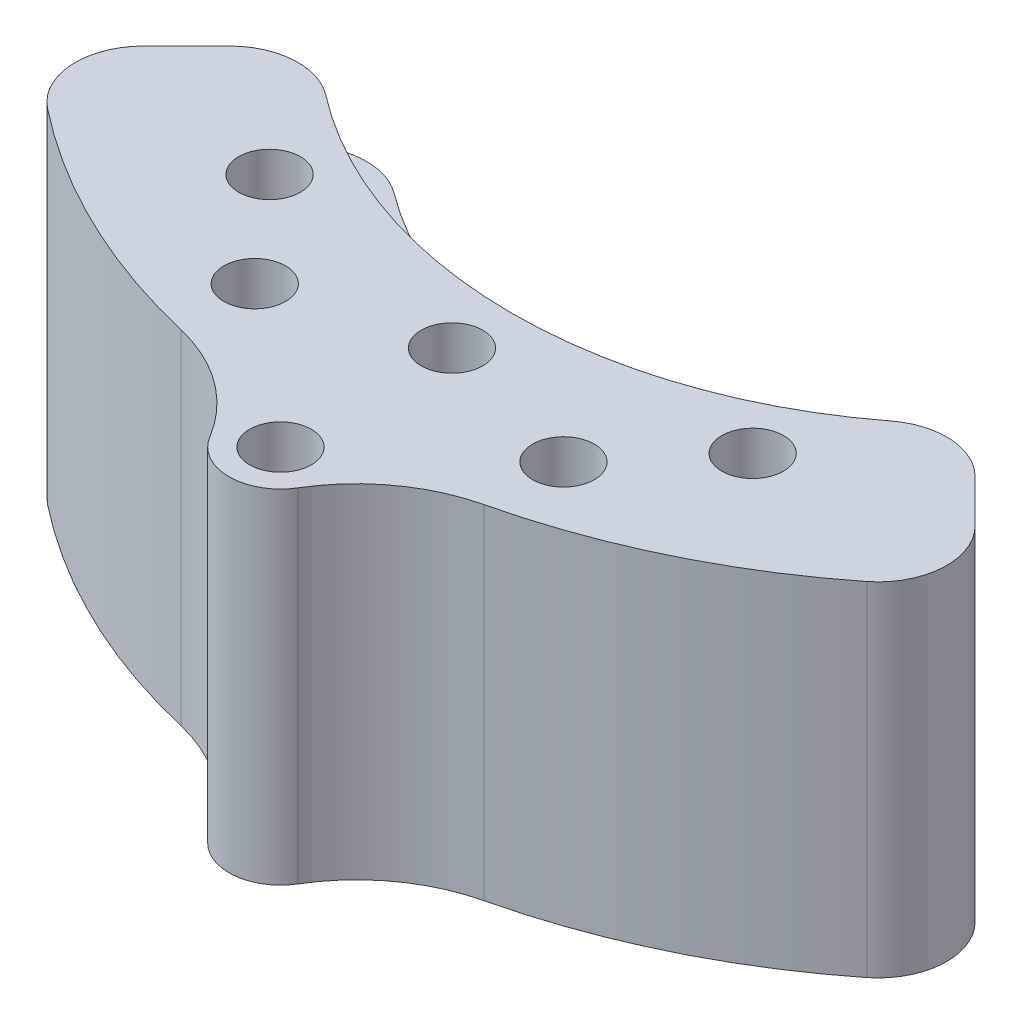
ISO-10303-21;
HEADER;
FILE_DESCRIPTION(('STEP AP214'),'2;1');
FILE_NAME('part.step','',(''),(''),'','','');
FILE_SCHEMA(('AUTOMOTIVE_DESIGN { 1 0 10303 214 1 1 1 1 }'));
ENDSEC;
DATA;
#1=APPLICATION_CONTEXT('core data for automotive mechanical design processes');
#2=APPLICATION_PROTOCOL_DEFINITION('international standard','automotive_design',2000,#1);
#3=PRODUCT_CONTEXT('',#1,'mechanical');
#4=PRODUCT('Part','Part','',(#3));
#5=PRODUCT_RELATED_PRODUCT_CATEGORY('part','',(#4));
#6=PRODUCT_DEFINITION_FORMATION('','',#4);
#7=PRODUCT_DEFINITION_CONTEXT('part definition',#1,'design');
#8=PRODUCT_DEFINITION('design','',#6,#7);
#9=PRODUCT_DEFINITION_SHAPE('','',#8);
#10=(LENGTH_UNIT() NAMED_UNIT(*) SI_UNIT(.MILLI.,.METRE.));
#11=(NAMED_UNIT(*) PLANE_ANGLE_UNIT() SI_UNIT($,.RADIAN.));
#12=(NAMED_UNIT(*) SI_UNIT($,.STERADIAN.) SOLID_ANGLE_UNIT());
#13=UNCERTAINTY_MEASURE_WITH_UNIT(LENGTH_MEASURE(1.E-05),#10,'distance_accuracy_value','');
#14=(GEOMETRIC_REPRESENTATION_CONTEXT(3) GLOBAL_UNCERTAINTY_ASSIGNED_CONTEXT((#13)) GLOBAL_UNIT_ASSIGNED_CONTEXT((#10,
#11,#12)) REPRESENTATION_CONTEXT('',''));
#15=CARTESIAN_POINT('',(0.,0.,0.));
#16=DIRECTION('',(0.,0.,1.));
#17=DIRECTION('',(1.,0.,0.));
#18=AXIS2_PLACEMENT_3D('',#15,#16,#17);
#19=CARTESIAN_POINT('',(0.,25.4,0.));
#20=DIRECTION('',(0.,-1.,0.));
#21=DIRECTION('',(0.,0.,-1.));
#22=AXIS2_PLACEMENT_3D('',#19,#20,#21);
#23=CYLINDRICAL_SURFACE('',#22,48.895);
#24=CARTESIAN_POINT('',(0.,0.,0.));
#25=DIRECTION('',(0.,1.,0.));
#26=DIRECTION('',(0.,0.,1.));
#27=AXIS2_PLACEMENT_3D('',#24,#25,#26);
#28=CIRCLE('',#27,48.895);
#29=CARTESIAN_POINT('',(-30.3322403894984,0.,38.3493965787427));
#30=VERTEX_POINT('',#29);
#31=CARTESIAN_POINT('',(-11.2289519784086,0.,47.5881462390225));
#32=VERTEX_POINT('',#31);
#33=EDGE_CURVE('E488',#30,#32,#28,.T.);
#34=ORIENTED_EDGE('',*,*,#33,.T.);
#35=DIRECTION('',(0.,-1.,0.));
#36=VECTOR('',#35,1.);
#37=CARTESIAN_POINT('',(-11.2289519784086,25.4,47.5881462390225));
#38=LINE('',#37,#36);
#39=CARTESIAN_POINT('',(-11.2289519784086,25.4,47.5881462390225));
#40=VERTEX_POINT('',#39);
#41=EDGE_CURVE('E384',#32,#40,#38,.F.);
#42=ORIENTED_EDGE('',*,*,#41,.T.);
#43=CARTESIAN_POINT('',(0.,25.4,0.));
#44=DIRECTION('',(0.,1.,0.));
#45=DIRECTION('',(0.,0.,1.));
#46=AXIS2_PLACEMENT_3D('',#43,#44,#45);
#47=CIRCLE('',#46,48.895);
#48=CARTESIAN_POINT('',(-30.3322403894984,25.4,38.3493965787427));
#49=VERTEX_POINT('',#48);
#50=EDGE_CURVE('E197',#49,#40,#47,.T.);
#51=ORIENTED_EDGE('',*,*,#50,.F.);
#52=DIRECTION('',(0.,-1.,0.));
#53=VECTOR('',#52,1.);
#54=CARTESIAN_POINT('',(-30.3322403894984,25.4,38.3493965787427));
#55=LINE('',#54,#53);
#56=EDGE_CURVE('E219',#49,#30,#55,.T.);
#57=ORIENTED_EDGE('',*,*,#56,.T.);
#58=EDGE_LOOP('',(#34,#42,#51,#57));
#59=FACE_BOUND('',#58,.T.);
#60=ADVANCED_FACE('F44',(#59),#23,.T.);
#61=CARTESIAN_POINT('',(0.,25.4,0.));
#62=DIRECTION('',(0.,-1.,0.));
#63=DIRECTION('',(0.,0.,-1.));
#64=AXIS2_PLACEMENT_3D('',#61,#62,#63);
#65=CYLINDRICAL_SURFACE('',#64,30.734);
#66=CARTESIAN_POINT('',(0.,19.05,0.));
#67=DIRECTION('',(0.,1.,0.));
#68=DIRECTION('',(0.,0.,1.));
#69=AXIS2_PLACEMENT_3D('',#66,#67,#68);
#70=CIRCLE('',#69,30.734);
#71=CARTESIAN_POINT('',(18.429901575853,19.05,24.5950703171259));
#72=VERTEX_POINT('',#71);
#73=CARTESIAN_POINT('',(-18.429901575853,19.05,24.595070317126));
#74=VERTEX_POINT('',#73);
#75=EDGE_CURVE('E447',#72,#74,#70,.F.);
#76=ORIENTED_EDGE('',*,*,#75,.F.);
#77=DIRECTION('',(0.,-1.,0.));
#78=VECTOR('',#77,1.);
#79=CARTESIAN_POINT('',(18.429901575853,25.4,24.595070317126));
#80=LINE('',#79,#78);
#81=CARTESIAN_POINT('',(18.429901575853,0.,24.5950703171259));
#82=VERTEX_POINT('',#81);
#83=EDGE_CURVE('E230',#72,#82,#80,.T.);
#84=ORIENTED_EDGE('',*,*,#83,.T.);
#85=CARTESIAN_POINT('',(0.,0.,0.));
#86=DIRECTION('',(0.,-1.,0.));
#87=DIRECTION('',(0.,0.,1.));
#88=AXIS2_PLACEMENT_3D('',#85,#86,#87);
#89=CIRCLE('',#88,30.734);
#90=CARTESIAN_POINT('',(-18.429901575853,0.,24.595070317126));
#91=VERTEX_POINT('',#90);
#92=EDGE_CURVE('E472',#82,#91,#89,.T.);
#93=ORIENTED_EDGE('',*,*,#92,.T.);
#94=DIRECTION('',(0.,-1.,0.));
#95=VECTOR('',#94,1.);
#96=CARTESIAN_POINT('',(-18.429901575853,25.4,24.595070317126));
#97=LINE('',#96,#95);
#98=EDGE_CURVE('E184',#91,#74,#97,.F.);
#99=ORIENTED_EDGE('',*,*,#98,.T.);
#100=EDGE_LOOP('',(#76,#84,#93,#99));
#101=FACE_BOUND('',#100,.T.);
#102=ADVANCED_FACE('F316',(#101),#65,.F.);
#103=CARTESIAN_POINT('',(0.,25.4,0.));
#104=DIRECTION('',(0.,1.,0.));
#105=DIRECTION('',(0.,0.,1.));
#106=AXIS2_PLACEMENT_3D('',#103,#104,#105);
#107=PLANE('',#106);
#108=CARTESIAN_POINT('',(11.43,25.4,41.91));
#109=DIRECTION('',(0.,1.,0.));
#110=DIRECTION('',(0.,0.,1.));
#111=AXIS2_PLACEMENT_3D('',#108,#109,#110);
#112=CIRCLE('',#111,2.286);
#113=CARTESIAN_POINT('',(11.43,25.4,44.196));
#114=VERTEX_POINT('',#113);
#115=EDGE_CURVE('E426',#114,#114,#112,.T.);
#116=ORIENTED_EDGE('',*,*,#115,.F.);
#117=EDGE_LOOP('',(#116));
#118=FACE_BOUND('',#117,.T.);
#119=CARTESIAN_POINT('',(-11.43,25.4,41.91));
#120=DIRECTION('',(0.,1.,0.));
#121=DIRECTION('',(0.,0.,-1.));
#122=AXIS2_PLACEMENT_3D('',#119,#120,#121);
#123=CIRCLE('',#122,2.286);
#124=CARTESIAN_POINT('',(-11.43,25.4,39.624));
#125=VERTEX_POINT('',#124);
#126=EDGE_CURVE('E432',#125,#125,#123,.T.);
#127=ORIENTED_EDGE('',*,*,#126,.F.);
#128=EDGE_LOOP('',(#127));
#129=FACE_BOUND('',#128,.T.);
#130=CARTESIAN_POINT('',(0.,25.4,0.));
#131=DIRECTION('',(0.,1.,0.));
#132=DIRECTION('',(0.,0.,1.));
#133=AXIS2_PLACEMENT_3D('',#130,#131,#132);
#134=CIRCLE('',#133,34.29);
#135=CARTESIAN_POINT('',(-20.9153934462159,25.4,27.1726041628326));
#136=VERTEX_POINT('',#135);
#137=CARTESIAN_POINT('',(20.9153934462164,25.4,27.1726041628322));
#138=VERTEX_POINT('',#137);
#139=EDGE_CURVE('E415',#136,#138,#134,.T.);
#140=ORIENTED_EDGE('',*,*,#139,.F.);
#141=CARTESIAN_POINT('',(-24.0139702530633,25.4,31.1981751499185));
#142=DIRECTION('',(0.,1.,0.));
#143=DIRECTION('',(0.,0.,1.));
#144=AXIS2_PLACEMENT_3D('',#141,#142,#143);
#145=CIRCLE('',#144,5.08);
#146=CARTESIAN_POINT('',(-27.6060727014909,25.4,27.6060727014908));
#147=VERTEX_POINT('',#146);
#148=EDGE_CURVE('E258',#136,#147,#145,.T.);
#149=ORIENTED_EDGE('',*,*,#148,.T.);
#150=DIRECTION('',(-0.707106781186549,0.,0.707106781186547));
#151=VECTOR('',#150,1.);
#152=CARTESIAN_POINT('',(-21.7322198129874,25.4,21.7322198129873));
#153=LINE('',#152,#151);
#154=CARTESIAN_POINT('',(-30.7729412390172,25.4,30.7729412390171));
#155=VERTEX_POINT('',#154);
#156=EDGE_CURVE('E377',#147,#155,#153,.T.);
#157=ORIENTED_EDGE('',*,*,#156,.T.);
#158=CARTESIAN_POINT('',(-27.1808387905895,25.4,34.3650436874447));
#159=DIRECTION('',(0.,1.,0.));
#160=DIRECTION('',(0.,0.,1.));
#161=AXIS2_PLACEMENT_3D('',#158,#159,#160);
#162=CIRCLE('',#161,5.08);
#163=EDGE_CURVE('E185',#155,#49,#162,.T.);
#164=ORIENTED_EDGE('',*,*,#163,.T.);
#165=ORIENTED_EDGE('',*,*,#50,.T.);
#166=CARTESIAN_POINT('',(-14.1455628818913,25.4,59.9487037037037));
#167=DIRECTION('',(0.,1.,0.));
#168=DIRECTION('',(0.,0.,1.));
#169=AXIS2_PLACEMENT_3D('',#166,#167,#168);
#170=CIRCLE('',#169,12.7);
#171=CARTESIAN_POINT('',(-3.26436066505185,25.4,53.3997008547009));
#172=VERTEX_POINT('',#171);
#173=EDGE_CURVE('E53',#40,#172,#170,.F.);
#174=ORIENTED_EDGE('',*,*,#173,.T.);
#175=CARTESIAN_POINT('',(0.,25.4,51.435));
#176=DIRECTION('',(0.,1.,0.));
#177=DIRECTION('',(0.,0.,1.));
#178=AXIS2_PLACEMENT_3D('',#175,#176,#177);
#179=CIRCLE('',#178,3.81);
#180=CARTESIAN_POINT('',(3.26436066505185,25.4,53.3997008547009));
#181=VERTEX_POINT('',#180);
#182=EDGE_CURVE('E401',#172,#181,#179,.T.);
#183=ORIENTED_EDGE('',*,*,#182,.T.);
#184=CARTESIAN_POINT('',(14.1455628818913,25.4,59.9487037037037));
#185=DIRECTION('',(0.,1.,0.));
#186=DIRECTION('',(0.,0.,1.));
#187=AXIS2_PLACEMENT_3D('',#184,#185,#186);
#188=CIRCLE('',#187,12.7);
#189=CARTESIAN_POINT('',(11.2289519784086,25.4,47.5881462390225));
#190=VERTEX_POINT('',#189);
#191=EDGE_CURVE('E380',#181,#190,#188,.F.);
#192=ORIENTED_EDGE('',*,*,#191,.T.);
#193=CARTESIAN_POINT('',(30.3322403894984,25.4,38.3493965787426));
#194=VERTEX_POINT('',#193);
#195=EDGE_CURVE('E178',#190,#194,#47,.T.);
#196=ORIENTED_EDGE('',*,*,#195,.T.);
#197=CARTESIAN_POINT('',(27.1808387905895,25.4,34.3650436874447));
#198=DIRECTION('',(0.,1.,0.));
#199=DIRECTION('',(0.,0.,1.));
#200=AXIS2_PLACEMENT_3D('',#197,#198,#199);
#201=CIRCLE('',#200,5.08);
#202=CARTESIAN_POINT('',(30.7729412390172,25.4,30.772941239017));
#203=VERTEX_POINT('',#202);
#204=EDGE_CURVE('E170',#194,#203,#201,.T.);
#205=ORIENTED_EDGE('',*,*,#204,.T.);
#206=DIRECTION('',(-0.707106781186549,0.,-0.707106781186546));
#207=VECTOR('',#206,1.);
#208=CARTESIAN_POINT('',(21.7322198129874,25.4,21.7322198129873));
#209=LINE('',#208,#207);
#210=CARTESIAN_POINT('',(27.6060727014909,25.4,27.6060727014908));
#211=VERTEX_POINT('',#210);
#212=EDGE_CURVE('E175',#203,#211,#209,.T.);
#213=ORIENTED_EDGE('',*,*,#212,.T.);
#214=CARTESIAN_POINT('',(24.0139702530633,25.4,31.1981751499185));
#215=DIRECTION('',(0.,1.,0.));
#216=DIRECTION('',(0.,0.,1.));
#217=AXIS2_PLACEMENT_3D('',#214,#215,#216);
#218=CIRCLE('',#217,5.08);
#219=EDGE_CURVE('E255',#211,#138,#218,.T.);
#220=ORIENTED_EDGE('',*,*,#219,.T.);
#221=EDGE_LOOP('',(#140,#149,#157,#164,#165,#174,#183,#192,#196,#205,#213,#220));
#222=FACE_BOUND('',#221,.T.);
#223=CARTESIAN_POINT('',(17.8858325336585,25.4,34.3583646231584));
#224=DIRECTION('',(0.,1.,0.));
#225=DIRECTION('',(0.,0.,1.));
#226=AXIS2_PLACEMENT_3D('',#223,#224,#225);
#227=CIRCLE('',#226,2.28600000000691);
#228=CARTESIAN_POINT('',(17.8858325336585,25.4,36.6443646231653));
#229=VERTEX_POINT('',#228);
#230=EDGE_CURVE('E460',#229,#229,#227,.T.);
#231=ORIENTED_EDGE('',*,*,#230,.F.);
#232=EDGE_LOOP('',(#231));
#233=FACE_BOUND('',#232,.T.);
#234=CARTESIAN_POINT('',(-5.73089360601551E-13,25.4,38.735));
#235=DIRECTION('',(0.,1.,0.));
#236=DIRECTION('',(0.,0.,1.));
#237=AXIS2_PLACEMENT_3D('',#234,#235,#236);
#238=CIRCLE('',#237,2.28600000000691);
#239=CARTESIAN_POINT('',(-5.73089360601551E-13,25.4,41.0210000000069));
#240=VERTEX_POINT('',#239);
#241=EDGE_CURVE('E468',#240,#240,#238,.T.);
#242=ORIENTED_EDGE('',*,*,#241,.F.);
#243=EDGE_LOOP('',(#242));
#244=FACE_BOUND('',#243,.T.);
#245=CARTESIAN_POINT('',(-17.8858325336597,25.4,34.3583646231584));
#246=DIRECTION('',(0.,1.,0.));
#247=DIRECTION('',(0.,0.,1.));
#248=AXIS2_PLACEMENT_3D('',#245,#246,#247);
#249=CIRCLE('',#248,2.28600000000691);
#250=CARTESIAN_POINT('',(-17.8858325336597,25.4,36.6443646231653));
#251=VERTEX_POINT('',#250);
#252=EDGE_CURVE('E452',#251,#251,#249,.T.);
#253=ORIENTED_EDGE('',*,*,#252,.F.);
#254=EDGE_LOOP('',(#253));
#255=FACE_BOUND('',#254,.T.);
#256=CARTESIAN_POINT('',(0.,25.4,51.435));
#257=DIRECTION('',(0.,1.,0.));
#258=DIRECTION('',(0.,0.,1.));
#259=AXIS2_PLACEMENT_3D('',#256,#257,#258);
#260=CIRCLE('',#259,2.286);
#261=CARTESIAN_POINT('',(0.,25.4,53.721));
#262=VERTEX_POINT('',#261);
#263=EDGE_CURVE('E407',#262,#262,#260,.T.);
#264=ORIENTED_EDGE('',*,*,#263,.F.);
#265=EDGE_LOOP('',(#264));
#266=FACE_BOUND('',#265,.T.);
#267=ADVANCED_FACE('F173',(#118,#129,#222,#233,#244,#255,#266),#107,.T.);
#268=CARTESIAN_POINT('',(0.,0.,0.));
#269=DIRECTION('',(0.,1.,0.));
#270=DIRECTION('',(0.,0.,1.));
#271=AXIS2_PLACEMENT_3D('',#268,#269,#270);
#272=PLANE('',#271);
#273=CARTESIAN_POINT('',(11.43,0.,41.91));
#274=DIRECTION('',(0.,1.,0.));
#275=DIRECTION('',(0.,0.,1.));
#276=AXIS2_PLACEMENT_3D('',#273,#274,#275);
#277=CIRCLE('',#276,2.286);
#278=CARTESIAN_POINT('',(11.43,0.,44.196));
#279=VERTEX_POINT('',#278);
#280=EDGE_CURVE('E418',#279,#279,#277,.T.);
#281=ORIENTED_EDGE('',*,*,#280,.T.);
#282=EDGE_LOOP('',(#281));
#283=FACE_BOUND('',#282,.T.);
#284=CARTESIAN_POINT('',(-11.43,0.,41.91));
#285=DIRECTION('',(0.,1.,0.));
#286=DIRECTION('',(0.,0.,-1.));
#287=AXIS2_PLACEMENT_3D('',#284,#285,#286);
#288=CIRCLE('',#287,2.286);
#289=CARTESIAN_POINT('',(-11.43,0.,39.624));
#290=VERTEX_POINT('',#289);
#291=EDGE_CURVE('E440',#290,#290,#288,.T.);
#292=ORIENTED_EDGE('',*,*,#291,.T.);
#293=EDGE_LOOP('',(#292));
#294=FACE_BOUND('',#293,.T.);
#295=DIRECTION('',(-0.707106781186549,0.,-0.707106781186546));
#296=VECTOR('',#295,1.);
#297=CARTESIAN_POINT('',(21.7322198129874,0.,21.7322198129873));
#298=LINE('',#297,#296);
#299=CARTESIAN_POINT('',(30.7729412390172,0.,30.772941239017));
#300=VERTEX_POINT('',#299);
#301=CARTESIAN_POINT('',(25.0682687475622,0.,25.0682687475621));
#302=VERTEX_POINT('',#301);
#303=EDGE_CURVE('E477',#300,#302,#298,.T.);
#304=ORIENTED_EDGE('',*,*,#303,.F.);
#305=CARTESIAN_POINT('',(27.1808387905895,0.,34.3650436874447));
#306=DIRECTION('',(0.,1.,0.));
#307=DIRECTION('',(0.,0.,1.));
#308=AXIS2_PLACEMENT_3D('',#305,#306,#307);
#309=CIRCLE('',#308,5.08);
#310=CARTESIAN_POINT('',(30.3322403894984,0.,38.3493965787426));
#311=VERTEX_POINT('',#310);
#312=EDGE_CURVE('E201',#300,#311,#309,.F.);
#313=ORIENTED_EDGE('',*,*,#312,.T.);
#314=CARTESIAN_POINT('',(11.2289519784086,0.,47.5881462390225));
#315=VERTEX_POINT('',#314);
#316=EDGE_CURVE('E487',#315,#311,#28,.T.);
#317=ORIENTED_EDGE('',*,*,#316,.F.);
#318=CARTESIAN_POINT('',(14.1455628818913,0.,59.9487037037037));
#319=DIRECTION('',(0.,1.,0.));
#320=DIRECTION('',(0.,0.,1.));
#321=AXIS2_PLACEMENT_3D('',#318,#319,#320);
#322=CIRCLE('',#321,12.7);
#323=CARTESIAN_POINT('',(3.26436066505185,0.,53.3997008547009));
#324=VERTEX_POINT('',#323);
#325=EDGE_CURVE('E382',#315,#324,#322,.T.);
#326=ORIENTED_EDGE('',*,*,#325,.T.);
#327=CARTESIAN_POINT('',(0.,0.,51.435));
#328=DIRECTION('',(0.,1.,0.));
#329=DIRECTION('',(0.,0.,1.));
#330=AXIS2_PLACEMENT_3D('',#327,#328,#329);
#331=CIRCLE('',#330,3.81);
#332=CARTESIAN_POINT('',(-3.26436066505185,0.,53.3997008547009));
#333=VERTEX_POINT('',#332);
#334=EDGE_CURVE('E406',#324,#333,#331,.F.);
#335=ORIENTED_EDGE('',*,*,#334,.T.);
#336=CARTESIAN_POINT('',(-14.1455628818913,0.,59.9487037037037));
#337=DIRECTION('',(0.,1.,0.));
#338=DIRECTION('',(0.,0.,1.));
#339=AXIS2_PLACEMENT_3D('',#336,#337,#338);
#340=CIRCLE('',#339,12.7);
#341=EDGE_CURVE('E11',#333,#32,#340,.T.);
#342=ORIENTED_EDGE('',*,*,#341,.T.);
#343=ORIENTED_EDGE('',*,*,#33,.F.);
#344=CARTESIAN_POINT('',(-27.1808387905895,0.,34.3650436874447));
#345=DIRECTION('',(0.,1.,0.));
#346=DIRECTION('',(0.,0.,1.));
#347=AXIS2_PLACEMENT_3D('',#344,#345,#346);
#348=CIRCLE('',#347,5.08);
#349=CARTESIAN_POINT('',(-30.7729412390172,0.,30.7729412390171));
#350=VERTEX_POINT('',#349);
#351=EDGE_CURVE('E207',#30,#350,#348,.F.);
#352=ORIENTED_EDGE('',*,*,#351,.T.);
#353=DIRECTION('',(-0.707106781186549,0.,0.707106781186547));
#354=VECTOR('',#353,1.);
#355=CARTESIAN_POINT('',(-21.7322198129874,0.,21.7322198129873));
#356=LINE('',#355,#354);
#357=CARTESIAN_POINT('',(-25.0682687475622,0.,25.0682687475621));
#358=VERTEX_POINT('',#357);
#359=EDGE_CURVE('E483',#358,#350,#356,.T.);
#360=ORIENTED_EDGE('',*,*,#359,.F.);
#361=CARTESIAN_POINT('',(-21.4761662991345,0.,28.6603711959898));
#362=DIRECTION('',(0.,1.,0.));
#363=DIRECTION('',(0.,0.,1.));
#364=AXIS2_PLACEMENT_3D('',#361,#362,#363);
#365=CIRCLE('',#364,5.08);
#366=EDGE_CURVE('E203',#358,#91,#365,.F.);
#367=ORIENTED_EDGE('',*,*,#366,.T.);
#368=ORIENTED_EDGE('',*,*,#92,.F.);
#369=CARTESIAN_POINT('',(21.4761662991345,0.,28.6603711959897));
#370=DIRECTION('',(0.,1.,0.));
#371=DIRECTION('',(0.,0.,1.));
#372=AXIS2_PLACEMENT_3D('',#369,#370,#371);
#373=CIRCLE('',#372,5.08);
#374=EDGE_CURVE('E214',#82,#302,#373,.F.);
#375=ORIENTED_EDGE('',*,*,#374,.T.);
#376=EDGE_LOOP('',(#304,#313,#317,#326,#335,#342,#343,#352,#360,#367,#368,#375));
#377=FACE_BOUND('',#376,.T.);
#378=CARTESIAN_POINT('',(-5.73089360601551E-13,0.,38.735));
#379=DIRECTION('',(0.,1.,0.));
#380=DIRECTION('',(0.,0.,1.));
#381=AXIS2_PLACEMENT_3D('',#378,#379,#380);
#382=CIRCLE('',#381,2.28600000000691);
#383=CARTESIAN_POINT('',(-5.73089360601551E-13,0.,41.0210000000069));
#384=VERTEX_POINT('',#383);
#385=EDGE_CURVE('E464',#384,#384,#382,.T.);
#386=ORIENTED_EDGE('',*,*,#385,.T.);
#387=EDGE_LOOP('',(#386));
#388=FACE_BOUND('',#387,.T.);
#389=CARTESIAN_POINT('',(17.8858325336585,0.,34.3583646231584));
#390=DIRECTION('',(0.,1.,0.));
#391=DIRECTION('',(0.,0.,1.));
#392=AXIS2_PLACEMENT_3D('',#389,#390,#391);
#393=CIRCLE('',#392,2.28600000000691);
#394=CARTESIAN_POINT('',(17.8858325336585,0.,36.6443646231653));
#395=VERTEX_POINT('',#394);
#396=EDGE_CURVE('E456',#395,#395,#393,.T.);
#397=ORIENTED_EDGE('',*,*,#396,.T.);
#398=EDGE_LOOP('',(#397));
#399=FACE_BOUND('',#398,.T.);
#400=CARTESIAN_POINT('',(-17.8858325336597,0.,34.3583646231584));
#401=DIRECTION('',(0.,1.,0.));
#402=DIRECTION('',(0.,0.,1.));
#403=AXIS2_PLACEMENT_3D('',#400,#401,#402);
#404=CIRCLE('',#403,2.28600000000691);
#405=CARTESIAN_POINT('',(-17.8858325336597,0.,36.6443646231653));
#406=VERTEX_POINT('',#405);
#407=EDGE_CURVE('E451',#406,#406,#404,.T.);
#408=ORIENTED_EDGE('',*,*,#407,.T.);
#409=EDGE_LOOP('',(#408));
#410=FACE_BOUND('',#409,.T.);
#411=CARTESIAN_POINT('',(0.,0.,51.435));
#412=DIRECTION('',(0.,1.,0.));
#413=DIRECTION('',(0.,0.,1.));
#414=AXIS2_PLACEMENT_3D('',#411,#412,#413);
#415=CIRCLE('',#414,2.286);
#416=CARTESIAN_POINT('',(0.,0.,53.721));
#417=VERTEX_POINT('',#416);
#418=EDGE_CURVE('E435',#417,#417,#415,.F.);
#419=ORIENTED_EDGE('',*,*,#418,.F.);
#420=EDGE_LOOP('',(#419));
#421=FACE_BOUND('',#420,.T.);
#422=ADVANCED_FACE('F313',(#283,#294,#377,#388,#399,#410,#421),#272,.F.);
#423=CARTESIAN_POINT('',(-21.7322198129874,25.4,21.7322198129873));
#424=DIRECTION('',(0.707106781186547,0.,0.707106781186548));
#425=DIRECTION('',(0.707106781186548,0.,-0.707106781186547));
#426=AXIS2_PLACEMENT_3D('',#423,#424,#425);
#427=PLANE('',#426);
#428=ORIENTED_EDGE('',*,*,#156,.F.);
#429=DIRECTION('',(0.,1.,0.));
#430=VECTOR('',#429,1.);
#431=CARTESIAN_POINT('',(-27.6060727014909,25.4,27.6060727014908));
#432=LINE('',#431,#430);
#433=CARTESIAN_POINT('',(-27.6060727014909,20.32,27.6060727014908));
#434=VERTEX_POINT('',#433);
#435=EDGE_CURVE('E261',#147,#434,#432,.F.);
#436=ORIENTED_EDGE('',*,*,#435,.T.);
#437=CARTESIAN_POINT('',(-25.0682687475622,19.056680184589,25.0682687475621));
#438=CARTESIAN_POINT('',(-25.1210593898725,19.0611233204197,25.1210593898725));
#439=CARTESIAN_POINT('',(-25.1737401248573,19.0676762562817,25.1737401248572));
#440=CARTESIAN_POINT('',(-25.2787671063146,19.0845754884665,25.2787671063145));
#441=CARTESIAN_POINT('',(-25.3311135336687,19.0949195182683,25.3311135336686));
#442=CARTESIAN_POINT('',(-25.4872488536364,19.1309367733097,25.4872488536363));
#443=CARTESIAN_POINT('',(-25.5904636333427,19.1616281614505,25.5904636333426));
#444=CARTESIAN_POINT('',(-25.7938624264079,19.2332316213773,25.7938624264078));
#445=CARTESIAN_POINT('',(-25.8940671008085,19.2740301658336,25.8940671008084));
#446=CARTESIAN_POINT('',(-26.0926891319383,19.3638447348191,26.0926891319382));
#447=CARTESIAN_POINT('',(-26.191104889314,19.4128677469193,26.1911048893139));
#448=CARTESIAN_POINT('',(-26.4007775570689,19.5250192114827,26.4007775570688));
#449=CARTESIAN_POINT('',(-26.5117603310838,19.5891609360223,26.5117603310837));
#450=CARTESIAN_POINT('',(-26.7319245718461,19.723388846505,26.7319245718461));
#451=CARTESIAN_POINT('',(-26.8411055488346,19.7934766178993,26.8411055488345));
#452=CARTESIAN_POINT('',(-27.1671846793583,20.0097468034529,27.1671846793582));
#453=CARTESIAN_POINT('',(-27.3821529846896,20.1616660526918,27.3821529846894));
#454=CARTESIAN_POINT('',(-27.6000623455929,20.3157500452155,27.6000623455928));
#455=CARTESIAN_POINT('',(-27.6030675263874,20.317875029109,27.6030675263873));
#456=CARTESIAN_POINT('',(-27.6060727014909,20.32,27.6060727014908));
#457=B_SPLINE_CURVE_WITH_KNOTS('',3,(#437,#438,#439,#440,#441,#442,#443,#444,#445,#446,#447,
#448,#449,#450,#451,#452,#453,#454,#455,#456),.UNSPECIFIED.,.F.,.F.,(4,2,2,2,2,2,2,2,2,4),(0.,
0.224291277668162,0.448448680034882,0.895366425962464,1.3374753616545,1.77996183656915,
2.28844690272496,2.79706797981763,3.8164436697207,3.83069849346568),.UNSPECIFIED.);
#458=CARTESIAN_POINT('',(-25.0682687475622,19.056680184589,25.0682687475621));
#459=VERTEX_POINT('',#458);
#460=EDGE_CURVE('E286',#434,#459,#457,.F.);
#461=ORIENTED_EDGE('',*,*,#460,.T.);
#462=DIRECTION('',(0.,-1.,0.));
#463=VECTOR('',#462,1.);
#464=CARTESIAN_POINT('',(-25.0682687475622,25.4,25.0682687475621));
#465=LINE('',#464,#463);
#466=EDGE_CURVE('E241',#459,#358,#465,.T.);
#467=ORIENTED_EDGE('',*,*,#466,.T.);
#468=ORIENTED_EDGE('',*,*,#359,.T.);
#469=DIRECTION('',(0.,-1.,0.));
#470=VECTOR('',#469,1.);
#471=CARTESIAN_POINT('',(-30.7729412390172,25.4,30.7729412390171));
#472=LINE('',#471,#470);
#473=EDGE_CURVE('E244',#350,#155,#472,.F.);
#474=ORIENTED_EDGE('',*,*,#473,.T.);
#475=EDGE_LOOP('',(#428,#436,#461,#467,#468,#474));
#476=FACE_BOUND('',#475,.T.);
#477=ADVANCED_FACE('F307',(#476),#427,.F.);
#478=ORIENTED_EDGE('',*,*,#195,.F.);
#479=DIRECTION('',(0.,-1.,0.));
#480=VECTOR('',#479,1.);
#481=CARTESIAN_POINT('',(11.2289519784086,25.4,47.5881462390225));
#482=LINE('',#481,#480);
#483=EDGE_CURVE('E374',#190,#315,#482,.T.);
#484=ORIENTED_EDGE('',*,*,#483,.T.);
#485=ORIENTED_EDGE('',*,*,#316,.T.);
#486=DIRECTION('',(0.,-1.,0.));
#487=VECTOR('',#486,1.);
#488=CARTESIAN_POINT('',(30.3322403894984,25.4,38.3493965787427));
#489=LINE('',#488,#487);
#490=EDGE_CURVE('E223',#311,#194,#489,.F.);
#491=ORIENTED_EDGE('',*,*,#490,.T.);
#492=EDGE_LOOP('',(#478,#484,#485,#491));
#493=FACE_BOUND('',#492,.T.);
#494=ADVANCED_FACE('F312',(#493),#23,.T.);
#495=CARTESIAN_POINT('',(21.7322198129874,25.4,21.7322198129873));
#496=DIRECTION('',(-0.707106781186546,0.,0.707106781186549));
#497=DIRECTION('',(0.707106781186549,0.,0.707106781186546));
#498=AXIS2_PLACEMENT_3D('',#495,#496,#497);
#499=PLANE('',#498);
#500=DIRECTION('',(0.,-1.,0.));
#501=VECTOR('',#500,1.);
#502=CARTESIAN_POINT('',(25.0682687475622,25.4,25.0682687475621));
#503=LINE('',#502,#501);
#504=CARTESIAN_POINT('',(25.0682687475622,19.056680184589,25.0682687475621));
#505=VERTEX_POINT('',#504);
#506=EDGE_CURVE('E196',#302,#505,#503,.F.);
#507=ORIENTED_EDGE('',*,*,#506,.T.);
#508=CARTESIAN_POINT('',(25.0682687475622,19.056680184589,25.0682687475621));
#509=CARTESIAN_POINT('',(25.1210593898725,19.0611233204197,25.1210593898724));
#510=CARTESIAN_POINT('',(25.1737401248573,19.0676762562816,25.1737401248572));
#511=CARTESIAN_POINT('',(25.2787671063145,19.0845754884665,25.2787671063144));
#512=CARTESIAN_POINT('',(25.3311135336686,19.0949195182683,25.3311135336685));
#513=CARTESIAN_POINT('',(25.4872488536361,19.1309367733096,25.487248853636));
#514=CARTESIAN_POINT('',(25.5904636333424,19.1616281614504,25.5904636333423));
#515=CARTESIAN_POINT('',(25.7938624264077,19.2332316213772,25.7938624264076));
#516=CARTESIAN_POINT('',(25.8940671008083,19.2740301658335,25.8940671008082));
#517=CARTESIAN_POINT('',(26.0926891319382,19.363844734819,26.0926891319381));
#518=CARTESIAN_POINT('',(26.191104889314,19.4128677469192,26.1911048893139));
#519=CARTESIAN_POINT('',(26.4007775570689,19.5250192114827,26.4007775570688));
#520=CARTESIAN_POINT('',(26.5117603310839,19.5891609360222,26.5117603310838));
#521=CARTESIAN_POINT('',(26.7319245718462,19.723388846505,26.7319245718461));
#522=CARTESIAN_POINT('',(26.8411055488346,19.7934766178995,26.8411055488345));
#523=CARTESIAN_POINT('',(27.1671846793585,20.0097468034525,27.1671846793583));
#524=CARTESIAN_POINT('',(27.3821529846904,20.1616660526896,27.3821529846902));
#525=CARTESIAN_POINT('',(27.600062345593,20.3157500452155,27.6000623455928));
#526=CARTESIAN_POINT('',(27.6030675263874,20.317875029109,27.6030675263873));
#527=CARTESIAN_POINT('',(27.6060727014909,20.32,27.6060727014908));
#528=B_SPLINE_CURVE_WITH_KNOTS('',3,(#508,#509,#510,#511,#512,#513,#514,#515,#516,#517,#518,
#519,#520,#521,#522,#523,#524,#525,#526,#527),.UNSPECIFIED.,.F.,.F.,(4,2,2,2,2,2,2,2,2,4),(0.,
0.224291277668032,0.448448680034624,0.895366425961999,1.33747536165428,1.77996183656915,
2.28844690272499,2.79706797981772,3.81644366972072,3.83069849346568),.UNSPECIFIED.);
#529=CARTESIAN_POINT('',(27.6060727014909,20.32,27.6060727014908));
#530=VERTEX_POINT('',#529);
#531=EDGE_CURVE('E338',#505,#530,#528,.T.);
#532=ORIENTED_EDGE('',*,*,#531,.T.);
#533=DIRECTION('',(0.,1.,0.));
#534=VECTOR('',#533,1.);
#535=CARTESIAN_POINT('',(27.6060727014909,25.4,27.6060727014908));
#536=LINE('',#535,#534);
#537=EDGE_CURVE('E194',#530,#211,#536,.T.);
#538=ORIENTED_EDGE('',*,*,#537,.T.);
#539=ORIENTED_EDGE('',*,*,#212,.F.);
#540=DIRECTION('',(0.,-1.,0.));
#541=VECTOR('',#540,1.);
#542=CARTESIAN_POINT('',(30.7729412390172,25.4,30.772941239017));
#543=LINE('',#542,#541);
#544=EDGE_CURVE('E191',#203,#300,#543,.T.);
#545=ORIENTED_EDGE('',*,*,#544,.T.);
#546=ORIENTED_EDGE('',*,*,#303,.T.);
#547=EDGE_LOOP('',(#507,#532,#538,#539,#545,#546));
#548=FACE_BOUND('',#547,.T.);
#549=ADVANCED_FACE('F189',(#548),#499,.F.);
#550=CARTESIAN_POINT('',(-5.73089360601551E-13,25.4,38.735));
#551=DIRECTION('',(0.,-1.,0.));
#552=DIRECTION('',(0.,0.,-1.));
#553=AXIS2_PLACEMENT_3D('',#550,#551,#552);
#554=CYLINDRICAL_SURFACE('',#553,2.28600000000691);
#555=ORIENTED_EDGE('',*,*,#241,.T.);
#556=EDGE_LOOP('',(#555));
#557=FACE_BOUND('',#556,.T.);
#558=ORIENTED_EDGE('',*,*,#385,.F.);
#559=EDGE_LOOP('',(#558));
#560=FACE_BOUND('',#559,.T.);
#561=ADVANCED_FACE('F372',(#557,#560),#554,.F.);
#562=CARTESIAN_POINT('',(17.8858325336585,25.4,34.3583646231584));
#563=DIRECTION('',(0.,-1.,0.));
#564=DIRECTION('',(0.,0.,-1.));
#565=AXIS2_PLACEMENT_3D('',#562,#563,#564);
#566=CYLINDRICAL_SURFACE('',#565,2.28600000000691);
#567=ORIENTED_EDGE('',*,*,#230,.T.);
#568=EDGE_LOOP('',(#567));
#569=FACE_BOUND('',#568,.T.);
#570=ORIENTED_EDGE('',*,*,#396,.F.);
#571=EDGE_LOOP('',(#570));
#572=FACE_BOUND('',#571,.T.);
#573=ADVANCED_FACE('F555',(#569,#572),#566,.F.);
#574=CARTESIAN_POINT('',(-17.8858325336597,25.4,34.3583646231584));
#575=DIRECTION('',(0.,-1.,0.));
#576=DIRECTION('',(0.,0.,-1.));
#577=AXIS2_PLACEMENT_3D('',#574,#575,#576);
#578=CYLINDRICAL_SURFACE('',#577,2.28600000000691);
#579=ORIENTED_EDGE('',*,*,#252,.T.);
#580=EDGE_LOOP('',(#579));
#581=FACE_BOUND('',#580,.T.);
#582=ORIENTED_EDGE('',*,*,#407,.F.);
#583=EDGE_LOOP('',(#582));
#584=FACE_BOUND('',#583,.T.);
#585=ADVANCED_FACE('F552',(#581,#584),#578,.F.);
#586=CARTESIAN_POINT('',(0.,19.05,0.));
#587=DIRECTION('',(0.,1.,0.));
#588=DIRECTION('',(0.,0.,1.));
#589=AXIS2_PLACEMENT_3D('',#586,#587,#588);
#590=CYLINDRICAL_SURFACE('',#589,34.29);
#591=DIRECTION('',(0.,1.,0.));
#592=VECTOR('',#591,1.);
#593=CARTESIAN_POINT('',(20.9153934462164,19.05,27.1726041628322));
#594=LINE('',#593,#592);
#595=CARTESIAN_POINT('',(20.9153934462164,20.32,27.1726041628322));
#596=VERTEX_POINT('',#595);
#597=EDGE_CURVE('E248',#138,#596,#594,.F.);
#598=ORIENTED_EDGE('',*,*,#597,.T.);
#599=CARTESIAN_POINT('',(0.,20.32,0.));
#600=DIRECTION('',(0.,1.,0.));
#601=DIRECTION('',(0.,0.,1.));
#602=AXIS2_PLACEMENT_3D('',#599,#600,#601);
#603=CIRCLE('',#602,34.29);
#604=CARTESIAN_POINT('',(-20.9153934462164,20.32,27.1726041628322));
#605=VERTEX_POINT('',#604);
#606=EDGE_CURVE('E283',#596,#605,#603,.F.);
#607=ORIENTED_EDGE('',*,*,#606,.T.);
#608=DIRECTION('',(0.,1.,0.));
#609=VECTOR('',#608,1.);
#610=CARTESIAN_POINT('',(-20.9153934462164,19.05,27.1726041628322));
#611=LINE('',#610,#609);
#612=EDGE_CURVE('E252',#605,#136,#611,.T.);
#613=ORIENTED_EDGE('',*,*,#612,.T.);
#614=ORIENTED_EDGE('',*,*,#139,.T.);
#615=EDGE_LOOP('',(#598,#607,#613,#614));
#616=FACE_BOUND('',#615,.T.);
#617=ADVANCED_FACE('F502',(#616),#590,.F.);
#618=CARTESIAN_POINT('',(0.,19.05,0.));
#619=DIRECTION('',(0.,1.,0.));
#620=DIRECTION('',(0.,0.,1.));
#621=AXIS2_PLACEMENT_3D('',#618,#619,#620);
#622=PLANE('',#621);
#623=CARTESIAN_POINT('',(-21.4761662991345,19.05,28.6603711959898));
#624=DIRECTION('',(0.,1.,0.));
#625=DIRECTION('',(0.,0.,1.));
#626=AXIS2_PLACEMENT_3D('',#623,#624,#625);
#627=CIRCLE('',#626,5.08);
#628=CARTESIAN_POINT('',(-24.9035707255041,19.05,24.9107980338682));
#629=VERTEX_POINT('',#628);
#630=EDGE_CURVE('E234',#74,#629,#627,.T.);
#631=ORIENTED_EDGE('',*,*,#630,.T.);
#632=CARTESIAN_POINT('',(-24.0139702530633,19.05,31.1981751499185));
#633=DIRECTION('',(0.,1.,0.));
#634=DIRECTION('',(0.,0.,1.));
#635=AXIS2_PLACEMENT_3D('',#632,#633,#634);
#636=CIRCLE('',#635,6.35);
#637=CARTESIAN_POINT('',(-20.1407492445047,19.05,26.1662114160607));
#638=VERTEX_POINT('',#637);
#639=EDGE_CURVE('E273',#629,#638,#636,.F.);
#640=ORIENTED_EDGE('',*,*,#639,.T.);
#641=CARTESIAN_POINT('',(0.,19.05,0.));
#642=DIRECTION('',(0.,1.,0.));
#643=DIRECTION('',(0.,0.,1.));
#644=AXIS2_PLACEMENT_3D('',#641,#642,#643);
#645=CIRCLE('',#644,33.02);
#646=CARTESIAN_POINT('',(20.1407492445047,19.05,26.1662114160607));
#647=VERTEX_POINT('',#646);
#648=EDGE_CURVE('E267',#638,#647,#645,.T.);
#649=ORIENTED_EDGE('',*,*,#648,.T.);
#650=CARTESIAN_POINT('',(24.0139702530633,19.05,31.1981751499185));
#651=DIRECTION('',(0.,1.,0.));
#652=DIRECTION('',(0.,0.,1.));
#653=AXIS2_PLACEMENT_3D('',#650,#651,#652);
#654=CIRCLE('',#653,6.35);
#655=CARTESIAN_POINT('',(24.9035707255041,19.05,24.9107980338682));
#656=VERTEX_POINT('',#655);
#657=EDGE_CURVE('E270',#647,#656,#654,.F.);
#658=ORIENTED_EDGE('',*,*,#657,.T.);
#659=CARTESIAN_POINT('',(21.4761662991345,19.05,28.6603711959897));
#660=DIRECTION('',(0.,1.,0.));
#661=DIRECTION('',(0.,0.,1.));
#662=AXIS2_PLACEMENT_3D('',#659,#660,#661);
#663=CIRCLE('',#662,5.08);
#664=EDGE_CURVE('E238',#656,#72,#663,.T.);
#665=ORIENTED_EDGE('',*,*,#664,.T.);
#666=ORIENTED_EDGE('',*,*,#75,.T.);
#667=EDGE_LOOP('',(#631,#640,#649,#658,#665,#666));
#668=FACE_BOUND('',#667,.T.);
#669=ADVANCED_FACE('F323',(#668),#622,.T.);
#670=CARTESIAN_POINT('',(27.1808387905895,25.4,34.3650436874447));
#671=DIRECTION('',(0.,-1.,0.));
#672=DIRECTION('',(0.,0.,-1.));
#673=AXIS2_PLACEMENT_3D('',#670,#671,#672);
#674=CYLINDRICAL_SURFACE('',#673,5.08);
#675=ORIENTED_EDGE('',*,*,#204,.F.);
#676=ORIENTED_EDGE('',*,*,#490,.F.);
#677=ORIENTED_EDGE('',*,*,#312,.F.);
#678=ORIENTED_EDGE('',*,*,#544,.F.);
#679=EDGE_LOOP('',(#675,#676,#677,#678));
#680=FACE_BOUND('',#679,.T.);
#681=ADVANCED_FACE('F199',(#680),#674,.T.);
#682=CARTESIAN_POINT('',(21.4761662991345,25.4,28.6603711959897));
#683=DIRECTION('',(0.,-1.,0.));
#684=DIRECTION('',(0.,0.,-1.));
#685=AXIS2_PLACEMENT_3D('',#682,#683,#684);
#686=CYLINDRICAL_SURFACE('',#685,5.08);
#687=ORIENTED_EDGE('',*,*,#664,.F.);
#688=CARTESIAN_POINT('',(24.9035707255041,19.05,24.9107980338682));
#689=CARTESIAN_POINT('',(24.9316330911719,19.0499867292237,24.9364503895686));
#690=CARTESIAN_POINT('',(24.9593891722317,19.0505367811476,24.9623991899498));
#691=CARTESIAN_POINT('',(25.0142885071608,19.0527635199322,25.0148894334197));
#692=CARTESIAN_POINT('',(25.0414317667871,19.0544401962046,25.0414308709365));
#693=CARTESIAN_POINT('',(25.0682687475622,19.056680184589,25.0682687475621));
#694=B_SPLINE_CURVE_WITH_KNOTS('',3,(#688,#689,#690,#691,#692,#693),.UNSPECIFIED.,.F.,.F.,(4,2,
4),(0.,0.114001690808608,0.228002310224836),.UNSPECIFIED.);
#695=EDGE_CURVE('E329',#656,#505,#694,.T.);
#696=ORIENTED_EDGE('',*,*,#695,.T.);
#697=ORIENTED_EDGE('',*,*,#506,.F.);
#698=ORIENTED_EDGE('',*,*,#374,.F.);
#699=ORIENTED_EDGE('',*,*,#83,.F.);
#700=EDGE_LOOP('',(#687,#696,#697,#698,#699));
#701=FACE_BOUND('',#700,.T.);
#702=ADVANCED_FACE('F322',(#701),#686,.T.);
#703=CARTESIAN_POINT('',(-27.1808387905895,25.4,34.3650436874447));
#704=DIRECTION('',(0.,-1.,0.));
#705=DIRECTION('',(0.,0.,-1.));
#706=AXIS2_PLACEMENT_3D('',#703,#704,#705);
#707=CYLINDRICAL_SURFACE('',#706,5.08);
#708=ORIENTED_EDGE('',*,*,#163,.F.);
#709=ORIENTED_EDGE('',*,*,#473,.F.);
#710=ORIENTED_EDGE('',*,*,#351,.F.);
#711=ORIENTED_EDGE('',*,*,#56,.F.);
#712=EDGE_LOOP('',(#708,#709,#710,#711));
#713=FACE_BOUND('',#712,.T.);
#714=ADVANCED_FACE('F327',(#713),#707,.T.);
#715=CARTESIAN_POINT('',(-21.4761662991345,25.4,28.6603711959898));
#716=DIRECTION('',(0.,-1.,0.));
#717=DIRECTION('',(0.,0.,-1.));
#718=AXIS2_PLACEMENT_3D('',#715,#716,#717);
#719=CYLINDRICAL_SURFACE('',#718,5.08);
#720=ORIENTED_EDGE('',*,*,#466,.F.);
#721=CARTESIAN_POINT('',(-25.0682687475622,19.056680184589,25.0682687475621));
#722=CARTESIAN_POINT('',(-25.041431766787,19.0544401962046,25.0414308709365));
#723=CARTESIAN_POINT('',(-25.0142885071608,19.0527635199322,25.0148894334197));
#724=CARTESIAN_POINT('',(-24.9593891722317,19.0505367811476,24.9623991899498));
#725=CARTESIAN_POINT('',(-24.9316330911719,19.0499867292237,24.9364503895686));
#726=CARTESIAN_POINT('',(-24.9035707255041,19.05,24.9107980338682));
#727=B_SPLINE_CURVE_WITH_KNOTS('',3,(#721,#722,#723,#724,#725,#726),.UNSPECIFIED.,.F.,.F.,(4,2,
4),(0.,0.114000619416227,0.228002310224831),.UNSPECIFIED.);
#728=EDGE_CURVE('E296',#459,#629,#727,.T.);
#729=ORIENTED_EDGE('',*,*,#728,.T.);
#730=ORIENTED_EDGE('',*,*,#630,.F.);
#731=ORIENTED_EDGE('',*,*,#98,.F.);
#732=ORIENTED_EDGE('',*,*,#366,.F.);
#733=EDGE_LOOP('',(#720,#729,#730,#731,#732));
#734=FACE_BOUND('',#733,.T.);
#735=ADVANCED_FACE('F523',(#734),#719,.T.);
#736=CARTESIAN_POINT('',(-24.0139702530633,19.05,31.1981751499185));
#737=DIRECTION('',(0.,1.,0.));
#738=DIRECTION('',(0.,0.,1.));
#739=AXIS2_PLACEMENT_3D('',#736,#737,#738);
#740=CYLINDRICAL_SURFACE('',#739,5.08);
#741=ORIENTED_EDGE('',*,*,#612,.F.);
#742=CARTESIAN_POINT('',(-24.0139702530633,20.32,31.1981751499185));
#743=DIRECTION('',(0.,1.,0.));
#744=DIRECTION('',(0.,0.,1.));
#745=AXIS2_PLACEMENT_3D('',#742,#743,#744);
#746=CIRCLE('',#745,5.08);
#747=EDGE_CURVE('E277',#605,#434,#746,.T.);
#748=ORIENTED_EDGE('',*,*,#747,.T.);
#749=ORIENTED_EDGE('',*,*,#435,.F.);
#750=ORIENTED_EDGE('',*,*,#148,.F.);
#751=EDGE_LOOP('',(#741,#748,#749,#750));
#752=FACE_BOUND('',#751,.T.);
#753=ADVANCED_FACE('F508',(#752),#740,.T.);
#754=CARTESIAN_POINT('',(24.0139702530633,19.05,31.1981751499185));
#755=DIRECTION('',(0.,1.,0.));
#756=DIRECTION('',(0.,0.,1.));
#757=AXIS2_PLACEMENT_3D('',#754,#755,#756);
#758=CYLINDRICAL_SURFACE('',#757,5.08);
#759=ORIENTED_EDGE('',*,*,#537,.F.);
#760=CARTESIAN_POINT('',(24.0139702530633,20.32,31.1981751499185));
#761=DIRECTION('',(0.,1.,0.));
#762=DIRECTION('',(0.,0.,1.));
#763=AXIS2_PLACEMENT_3D('',#760,#761,#762);
#764=CIRCLE('',#763,5.08);
#765=EDGE_CURVE('E280',#530,#596,#764,.T.);
#766=ORIENTED_EDGE('',*,*,#765,.T.);
#767=ORIENTED_EDGE('',*,*,#597,.F.);
#768=ORIENTED_EDGE('',*,*,#219,.F.);
#769=EDGE_LOOP('',(#759,#766,#767,#768));
#770=FACE_BOUND('',#769,.T.);
#771=ADVANCED_FACE('F348',(#770),#758,.T.);
#772=CARTESIAN_POINT('',(24.0139702530633,20.32,31.1981751499185));
#773=DIRECTION('',(0.,1.,0.));
#774=DIRECTION('',(0.,0.,1.));
#775=AXIS2_PLACEMENT_3D('',#772,#773,#774);
#776=TOROIDAL_SURFACE('',#775,6.35,1.27);
#777=ORIENTED_EDGE('',*,*,#695,.F.);
#778=ORIENTED_EDGE('',*,*,#657,.F.);
#779=CARTESIAN_POINT('',(20.1407492445047,20.32,26.1662114160607));
#780=DIRECTION('',(0.792435233678397,0.,-0.609956064339936));
#781=DIRECTION('',(-0.609956064339936,0.,-0.792435233678397));
#782=AXIS2_PLACEMENT_3D('',#779,#780,#781);
#783=CIRCLE('',#782,1.27);
#784=EDGE_CURVE('E412',#596,#647,#783,.T.);
#785=ORIENTED_EDGE('',*,*,#784,.F.);
#786=ORIENTED_EDGE('',*,*,#765,.F.);
#787=ORIENTED_EDGE('',*,*,#531,.F.);
#788=EDGE_LOOP('',(#777,#778,#785,#786,#787));
#789=FACE_BOUND('',#788,.T.);
#790=ADVANCED_FACE('F344',(#789),#776,.F.);
#791=CARTESIAN_POINT('',(0.,20.32,0.));
#792=DIRECTION('',(0.,1.,0.));
#793=DIRECTION('',(0.,0.,1.));
#794=AXIS2_PLACEMENT_3D('',#791,#792,#793);
#795=TOROIDAL_SURFACE('',#794,33.02,1.27);
#796=ORIENTED_EDGE('',*,*,#784,.T.);
#797=ORIENTED_EDGE('',*,*,#648,.F.);
#798=CARTESIAN_POINT('',(-20.1407492445047,20.32,26.1662114160607));
#799=DIRECTION('',(0.792435233678397,0.,0.609956064339936));
#800=DIRECTION('',(0.609956064339936,0.,-0.792435233678397));
#801=AXIS2_PLACEMENT_3D('',#798,#799,#800);
#802=CIRCLE('',#801,1.27);
#803=EDGE_CURVE('E416',#605,#638,#802,.T.);
#804=ORIENTED_EDGE('',*,*,#803,.F.);
#805=ORIENTED_EDGE('',*,*,#606,.F.);
#806=EDGE_LOOP('',(#796,#797,#804,#805));
#807=FACE_BOUND('',#806,.T.);
#808=ADVANCED_FACE('F347',(#807),#795,.F.);
#809=CARTESIAN_POINT('',(-24.0139702530633,20.32,31.1981751499185));
#810=DIRECTION('',(0.,1.,0.));
#811=DIRECTION('',(0.,0.,1.));
#812=AXIS2_PLACEMENT_3D('',#809,#810,#811);
#813=TOROIDAL_SURFACE('',#812,6.35,1.27);
#814=ORIENTED_EDGE('',*,*,#460,.F.);
#815=ORIENTED_EDGE('',*,*,#747,.F.);
#816=ORIENTED_EDGE('',*,*,#803,.T.);
#817=ORIENTED_EDGE('',*,*,#639,.F.);
#818=ORIENTED_EDGE('',*,*,#728,.F.);
#819=EDGE_LOOP('',(#814,#815,#816,#817,#818));
#820=FACE_BOUND('',#819,.T.);
#821=ADVANCED_FACE('F303',(#820),#813,.F.);
#822=CARTESIAN_POINT('',(-11.43,0.,41.91));
#823=DIRECTION('',(0.,1.,0.));
#824=DIRECTION('',(0.,0.,1.));
#825=AXIS2_PLACEMENT_3D('',#822,#823,#824);
#826=CYLINDRICAL_SURFACE('',#825,2.286);
#827=ORIENTED_EDGE('',*,*,#291,.F.);
#828=EDGE_LOOP('',(#827));
#829=FACE_BOUND('',#828,.T.);
#830=ORIENTED_EDGE('',*,*,#126,.T.);
#831=EDGE_LOOP('',(#830));
#832=FACE_BOUND('',#831,.T.);
#833=ADVANCED_FACE('F532',(#829,#832),#826,.F.);
#834=CARTESIAN_POINT('',(11.43,0.,41.91));
#835=DIRECTION('',(0.,1.,0.));
#836=DIRECTION('',(0.,0.,1.));
#837=AXIS2_PLACEMENT_3D('',#834,#835,#836);
#838=CYLINDRICAL_SURFACE('',#837,2.286);
#839=ORIENTED_EDGE('',*,*,#280,.F.);
#840=EDGE_LOOP('',(#839));
#841=FACE_BOUND('',#840,.T.);
#842=ORIENTED_EDGE('',*,*,#115,.T.);
#843=EDGE_LOOP('',(#842));
#844=FACE_BOUND('',#843,.T.);
#845=ADVANCED_FACE('F536',(#841,#844),#838,.F.);
#846=CARTESIAN_POINT('',(0.,-9.96938629353152,51.435));
#847=DIRECTION('',(0.,1.,0.));
#848=DIRECTION('',(0.,0.,1.));
#849=AXIS2_PLACEMENT_3D('',#846,#847,#848);
#850=CYLINDRICAL_SURFACE('',#849,3.81);
#851=ORIENTED_EDGE('',*,*,#334,.F.);
#852=DIRECTION('',(0.,1.,0.));
#853=VECTOR('',#852,1.);
#854=CARTESIAN_POINT('',(3.26436066505185,-9.96938629353152,53.3997008547009));
#855=LINE('',#854,#853);
#856=EDGE_CURVE('E385',#324,#181,#855,.T.);
#857=ORIENTED_EDGE('',*,*,#856,.T.);
#858=ORIENTED_EDGE('',*,*,#182,.F.);
#859=DIRECTION('',(0.,1.,0.));
#860=VECTOR('',#859,1.);
#861=CARTESIAN_POINT('',(-3.26436066505184,-9.96938629353152,53.3997008547009));
#862=LINE('',#861,#860);
#863=EDGE_CURVE('E390',#172,#333,#862,.F.);
#864=ORIENTED_EDGE('',*,*,#863,.T.);
#865=EDGE_LOOP('',(#851,#857,#858,#864));
#866=FACE_BOUND('',#865,.T.);
#867=ADVANCED_FACE('F359',(#866),#850,.T.);
#868=CARTESIAN_POINT('',(0.,-9.96938629353152,51.435));
#869=DIRECTION('',(0.,1.,0.));
#870=DIRECTION('',(0.,0.,1.));
#871=AXIS2_PLACEMENT_3D('',#868,#869,#870);
#872=CYLINDRICAL_SURFACE('',#871,2.286);
#873=ORIENTED_EDGE('',*,*,#418,.T.);
#874=EDGE_LOOP('',(#873));
#875=FACE_BOUND('',#874,.T.);
#876=ORIENTED_EDGE('',*,*,#263,.T.);
#877=EDGE_LOOP('',(#876));
#878=FACE_BOUND('',#877,.T.);
#879=ADVANCED_FACE('F353',(#875,#878),#872,.F.);
#880=CARTESIAN_POINT('',(14.1455628818913,25.4,59.9487037037037));
#881=DIRECTION('',(0.,-1.,0.));
#882=DIRECTION('',(0.,0.,-1.));
#883=AXIS2_PLACEMENT_3D('',#880,#881,#882);
#884=CYLINDRICAL_SURFACE('',#883,12.7);
#885=ORIENTED_EDGE('',*,*,#325,.F.);
#886=ORIENTED_EDGE('',*,*,#483,.F.);
#887=ORIENTED_EDGE('',*,*,#191,.F.);
#888=ORIENTED_EDGE('',*,*,#856,.F.);
#889=EDGE_LOOP('',(#885,#886,#887,#888));
#890=FACE_BOUND('',#889,.T.);
#891=ADVANCED_FACE('F350',(#890),#884,.F.);
#892=CARTESIAN_POINT('',(-14.1455628818913,-9.96938629353152,59.9487037037037));
#893=DIRECTION('',(0.,-1.,0.));
#894=DIRECTION('',(0.,0.,-1.));
#895=AXIS2_PLACEMENT_3D('',#892,#893,#894);
#896=CYLINDRICAL_SURFACE('',#895,12.7);
#897=ORIENTED_EDGE('',*,*,#341,.F.);
#898=ORIENTED_EDGE('',*,*,#863,.F.);
#899=ORIENTED_EDGE('',*,*,#173,.F.);
#900=ORIENTED_EDGE('',*,*,#41,.F.);
#901=EDGE_LOOP('',(#897,#898,#899,#900));
#902=FACE_BOUND('',#901,.T.);
#903=ADVANCED_FACE('F46',(#902),#896,.F.);
#904=CLOSED_SHELL('',(#60,#102,#267,#422,#477,#494,#549,#561,#573,#585,#617,#669,#681,#702,#714,
#735,#753,#771,#790,#808,#821,#833,#845,#867,#879,#891,#903));
#905=MANIFOLD_SOLID_BREP('B2',#904);
#906=ADVANCED_BREP_SHAPE_REPRESENTATION('',(#18,#905),#14);
#907=SHAPE_DEFINITION_REPRESENTATION(#9,#906);
ENDSEC;
END-ISO-10303-21;
